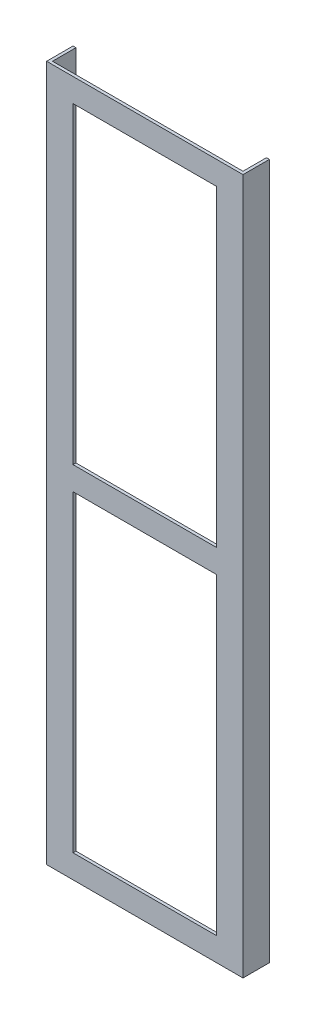
ISO-10303-21;
HEADER;
FILE_DESCRIPTION(('STEP AP214'),'2;1');
FILE_NAME('part.step','',(''),(''),'','','');
FILE_SCHEMA(('AUTOMOTIVE_DESIGN { 1 0 10303 214 1 1 1 1 }'));
ENDSEC;
DATA;
#1=APPLICATION_CONTEXT('core data for automotive mechanical design processes');
#2=APPLICATION_PROTOCOL_DEFINITION('international standard','automotive_design',2000,#1);
#3=PRODUCT_CONTEXT('',#1,'mechanical');
#4=PRODUCT('Part','Part','',(#3));
#5=PRODUCT_RELATED_PRODUCT_CATEGORY('part','',(#4));
#6=PRODUCT_DEFINITION_FORMATION('','',#4);
#7=PRODUCT_DEFINITION_CONTEXT('part definition',#1,'design');
#8=PRODUCT_DEFINITION('design','',#6,#7);
#9=PRODUCT_DEFINITION_SHAPE('','',#8);
#10=(LENGTH_UNIT() NAMED_UNIT(*) SI_UNIT(.MILLI.,.METRE.));
#11=(NAMED_UNIT(*) PLANE_ANGLE_UNIT() SI_UNIT($,.RADIAN.));
#12=(NAMED_UNIT(*) SI_UNIT($,.STERADIAN.) SOLID_ANGLE_UNIT());
#13=UNCERTAINTY_MEASURE_WITH_UNIT(LENGTH_MEASURE(1.E-05),#10,'distance_accuracy_value','');
#14=(GEOMETRIC_REPRESENTATION_CONTEXT(3) GLOBAL_UNCERTAINTY_ASSIGNED_CONTEXT((#13)) GLOBAL_UNIT_ASSIGNED_CONTEXT((#10,
#11,#12)) REPRESENTATION_CONTEXT('',''));
#15=CARTESIAN_POINT('',(0.,0.,0.));
#16=DIRECTION('',(0.,0.,1.));
#17=DIRECTION('',(1.,0.,0.));
#18=AXIS2_PLACEMENT_3D('',#15,#16,#17);
#19=CARTESIAN_POINT('',(50.,376.8,50.));
#20=DIRECTION('',(0.,0.,-1.));
#21=DIRECTION('',(-1.,0.,0.));
#22=AXIS2_PLACEMENT_3D('',#19,#20,#21);
#23=PLANE('',#22);
#24=DIRECTION('',(0.,1.,0.));
#25=VECTOR('',#24,1.);
#26=CARTESIAN_POINT('',(-38.8875000000002,376.8,50.));
#27=LINE('',#26,#25);
#28=CARTESIAN_POINT('',(-38.8875000000002,194.75,50.));
#29=VERTEX_POINT('',#28);
#30=CARTESIAN_POINT('',(-38.8875000000002,364.1,50.));
#31=VERTEX_POINT('',#30);
#32=EDGE_CURVE('E213',#29,#31,#27,.T.);
#33=ORIENTED_EDGE('',*,*,#32,.F.);
#34=DIRECTION('',(1.,0.,0.));
#35=VECTOR('',#34,1.);
#36=CARTESIAN_POINT('',(0.,194.75,50.));
#37=LINE('',#36,#35);
#38=CARTESIAN_POINT('',(38.8874999999998,194.75,50.));
#39=VERTEX_POINT('',#38);
#40=EDGE_CURVE('E218',#29,#39,#37,.T.);
#41=ORIENTED_EDGE('',*,*,#40,.T.);
#42=DIRECTION('',(0.,-1.,0.));
#43=VECTOR('',#42,1.);
#44=CARTESIAN_POINT('',(38.8874999999998,376.8,50.));
#45=LINE('',#44,#43);
#46=CARTESIAN_POINT('',(38.8874999999998,364.1,50.));
#47=VERTEX_POINT('',#46);
#48=EDGE_CURVE('E237',#47,#39,#45,.T.);
#49=ORIENTED_EDGE('',*,*,#48,.F.);
#50=DIRECTION('',(1.,0.,0.));
#51=VECTOR('',#50,1.);
#52=CARTESIAN_POINT('',(50.,364.1,50.));
#53=LINE('',#52,#51);
#54=EDGE_CURVE('E227',#31,#47,#53,.T.);
#55=ORIENTED_EDGE('',*,*,#54,.F.);
#56=EDGE_LOOP('',(#33,#41,#49,#55));
#57=FACE_BOUND('',#56,.T.);
#58=DIRECTION('',(1.,0.,0.));
#59=VECTOR('',#58,1.);
#60=CARTESIAN_POINT('',(0.,182.05,50.));
#61=LINE('',#60,#59);
#62=CARTESIAN_POINT('',(-38.8875000000002,182.05,50.));
#63=VERTEX_POINT('',#62);
#64=CARTESIAN_POINT('',(38.8874999999998,182.05,50.));
#65=VERTEX_POINT('',#64);
#66=EDGE_CURVE('E47',#63,#65,#61,.T.);
#67=ORIENTED_EDGE('',*,*,#66,.F.);
#68=CARTESIAN_POINT('',(-38.8875000000001,12.7,50.));
#69=VERTEX_POINT('',#68);
#70=EDGE_CURVE('E241',#69,#63,#27,.T.);
#71=ORIENTED_EDGE('',*,*,#70,.F.);
#72=DIRECTION('',(-1.,0.,0.));
#73=VECTOR('',#72,1.);
#74=CARTESIAN_POINT('',(50.,12.7,50.));
#75=LINE('',#74,#73);
#76=CARTESIAN_POINT('',(38.8874999999997,12.7,50.));
#77=VERTEX_POINT('',#76);
#78=EDGE_CURVE('E226',#77,#69,#75,.T.);
#79=ORIENTED_EDGE('',*,*,#78,.F.);
#80=EDGE_CURVE('E230',#65,#77,#45,.T.);
#81=ORIENTED_EDGE('',*,*,#80,.F.);
#82=EDGE_LOOP('',(#67,#71,#79,#81));
#83=FACE_BOUND('',#82,.T.);
#84=DIRECTION('',(1.,0.,0.));
#85=VECTOR('',#84,1.);
#86=CARTESIAN_POINT('',(-51.6,0.,50.));
#87=LINE('',#86,#85);
#88=CARTESIAN_POINT('',(-51.5875000000001,0.,50.));
#89=VERTEX_POINT('',#88);
#90=CARTESIAN_POINT('',(51.5875,0.,50.));
#91=VERTEX_POINT('',#90);
#92=EDGE_CURVE('E60',#89,#91,#87,.T.);
#93=ORIENTED_EDGE('',*,*,#92,.F.);
#94=DIRECTION('',(0.,-1.,0.));
#95=VECTOR('',#94,1.);
#96=CARTESIAN_POINT('',(-51.5875,376.8,50.));
#97=LINE('',#96,#95);
#98=CARTESIAN_POINT('',(-51.5875,376.8,50.));
#99=VERTEX_POINT('',#98);
#100=EDGE_CURVE('E55',#99,#89,#97,.T.);
#101=ORIENTED_EDGE('',*,*,#100,.F.);
#102=DIRECTION('',(1.,0.,0.));
#103=VECTOR('',#102,1.);
#104=CARTESIAN_POINT('',(50.,376.8,50.));
#105=LINE('',#104,#103);
#106=CARTESIAN_POINT('',(51.5875,376.8,50.));
#107=VERTEX_POINT('',#106);
#108=EDGE_CURVE('E41',#99,#107,#105,.T.);
#109=ORIENTED_EDGE('',*,*,#108,.T.);
#110=DIRECTION('',(0.,1.,0.));
#111=VECTOR('',#110,1.);
#112=CARTESIAN_POINT('',(51.5875,376.8,50.));
#113=LINE('',#112,#111);
#114=EDGE_CURVE('E184',#91,#107,#113,.T.);
#115=ORIENTED_EDGE('',*,*,#114,.F.);
#116=EDGE_LOOP('',(#93,#101,#109,#115));
#117=FACE_BOUND('',#116,.T.);
#118=ADVANCED_FACE('F37',(#57,#83,#117),#23,.T.);
#119=CARTESIAN_POINT('',(0.,376.8,0.));
#120=DIRECTION('',(0.,-1.,0.));
#121=DIRECTION('',(0.,0.,-1.));
#122=AXIS2_PLACEMENT_3D('',#119,#120,#121);
#123=PLANE('',#122);
#124=DIRECTION('',(1.,0.,0.));
#125=VECTOR('',#124,1.);
#126=CARTESIAN_POINT('',(51.5875,376.8,51.5875));
#127=LINE('',#126,#125);
#128=CARTESIAN_POINT('',(-53.175,376.8,51.5875));
#129=VERTEX_POINT('',#128);
#130=CARTESIAN_POINT('',(53.175,376.8,51.5875));
#131=VERTEX_POINT('',#130);
#132=EDGE_CURVE('E214',#129,#131,#127,.T.);
#133=ORIENTED_EDGE('',*,*,#132,.T.);
#134=DIRECTION('',(0.,0.,1.));
#135=VECTOR('',#134,1.);
#136=CARTESIAN_POINT('',(53.175,376.8,51.5875));
#137=LINE('',#136,#135);
#138=CARTESIAN_POINT('',(53.175,376.8,37.3));
#139=VERTEX_POINT('',#138);
#140=EDGE_CURVE('E282',#139,#131,#137,.T.);
#141=ORIENTED_EDGE('',*,*,#140,.F.);
#142=DIRECTION('',(1.,0.,0.));
#143=VECTOR('',#142,1.);
#144=CARTESIAN_POINT('',(53.175,376.8,37.3));
#145=LINE('',#144,#143);
#146=CARTESIAN_POINT('',(51.5875,376.8,37.3));
#147=VERTEX_POINT('',#146);
#148=EDGE_CURVE('E192',#147,#139,#145,.T.);
#149=ORIENTED_EDGE('',*,*,#148,.F.);
#150=DIRECTION('',(0.,0.,1.));
#151=VECTOR('',#150,1.);
#152=CARTESIAN_POINT('',(51.5875,376.8,37.3));
#153=LINE('',#152,#151);
#154=EDGE_CURVE('E195',#147,#107,#153,.T.);
#155=ORIENTED_EDGE('',*,*,#154,.T.);
#156=ORIENTED_EDGE('',*,*,#108,.F.);
#157=DIRECTION('',(0.,0.,1.));
#158=VECTOR('',#157,1.);
#159=CARTESIAN_POINT('',(-51.5875,376.8,37.3));
#160=LINE('',#159,#158);
#161=CARTESIAN_POINT('',(-51.5875,376.8,37.3));
#162=VERTEX_POINT('',#161);
#163=EDGE_CURVE('E166',#162,#99,#160,.T.);
#164=ORIENTED_EDGE('',*,*,#163,.F.);
#165=DIRECTION('',(1.,0.,0.));
#166=VECTOR('',#165,1.);
#167=CARTESIAN_POINT('',(-53.175,376.8,37.3));
#168=LINE('',#167,#166);
#169=CARTESIAN_POINT('',(-53.175,376.8,37.3));
#170=VERTEX_POINT('',#169);
#171=EDGE_CURVE('E164',#170,#162,#168,.T.);
#172=ORIENTED_EDGE('',*,*,#171,.F.);
#173=DIRECTION('',(0.,0.,1.));
#174=VECTOR('',#173,1.);
#175=CARTESIAN_POINT('',(-53.175,376.8,51.5875));
#176=LINE('',#175,#174);
#177=EDGE_CURVE('E152',#170,#129,#176,.T.);
#178=ORIENTED_EDGE('',*,*,#177,.T.);
#179=EDGE_LOOP('',(#133,#141,#149,#155,#156,#164,#172,#178));
#180=FACE_BOUND('',#179,.T.);
#181=ADVANCED_FACE('F39',(#180),#123,.F.);
#182=CARTESIAN_POINT('',(0.,0.,0.));
#183=DIRECTION('',(0.,-1.,0.));
#184=DIRECTION('',(0.,0.,-1.));
#185=AXIS2_PLACEMENT_3D('',#182,#183,#184);
#186=PLANE('',#185);
#187=DIRECTION('',(0.,0.,-1.));
#188=VECTOR('',#187,1.);
#189=CARTESIAN_POINT('',(-53.175,0.,51.5875));
#190=LINE('',#189,#188);
#191=CARTESIAN_POINT('',(-53.175,0.,51.5875));
#192=VERTEX_POINT('',#191);
#193=CARTESIAN_POINT('',(-53.175,0.,37.3));
#194=VERTEX_POINT('',#193);
#195=EDGE_CURVE('E161',#192,#194,#190,.T.);
#196=ORIENTED_EDGE('',*,*,#195,.T.);
#197=DIRECTION('',(-1.,0.,0.));
#198=VECTOR('',#197,1.);
#199=CARTESIAN_POINT('',(-53.175,0.,37.3));
#200=LINE('',#199,#198);
#201=CARTESIAN_POINT('',(-51.5875000000001,0.,37.3));
#202=VERTEX_POINT('',#201);
#203=EDGE_CURVE('E174',#202,#194,#200,.T.);
#204=ORIENTED_EDGE('',*,*,#203,.F.);
#205=DIRECTION('',(0.,0.,1.));
#206=VECTOR('',#205,1.);
#207=CARTESIAN_POINT('',(-51.5875000000001,0.,37.3));
#208=LINE('',#207,#206);
#209=EDGE_CURVE('E179',#202,#89,#208,.T.);
#210=ORIENTED_EDGE('',*,*,#209,.T.);
#211=ORIENTED_EDGE('',*,*,#92,.T.);
#212=DIRECTION('',(0.,0.,1.));
#213=VECTOR('',#212,1.);
#214=CARTESIAN_POINT('',(51.5875,0.,37.3));
#215=LINE('',#214,#213);
#216=CARTESIAN_POINT('',(51.5875,0.,37.3));
#217=VERTEX_POINT('',#216);
#218=EDGE_CURVE('E206',#217,#91,#215,.T.);
#219=ORIENTED_EDGE('',*,*,#218,.F.);
#220=DIRECTION('',(-1.,0.,0.));
#221=VECTOR('',#220,1.);
#222=CARTESIAN_POINT('',(53.175,0.,37.3));
#223=LINE('',#222,#221);
#224=CARTESIAN_POINT('',(53.175,0.,37.3));
#225=VERTEX_POINT('',#224);
#226=EDGE_CURVE('E188',#225,#217,#223,.T.);
#227=ORIENTED_EDGE('',*,*,#226,.F.);
#228=DIRECTION('',(0.,0.,-1.));
#229=VECTOR('',#228,1.);
#230=CARTESIAN_POINT('',(53.175,0.,51.5875));
#231=LINE('',#230,#229);
#232=CARTESIAN_POINT('',(53.175,0.,51.5875));
#233=VERTEX_POINT('',#232);
#234=EDGE_CURVE('E345',#233,#225,#231,.T.);
#235=ORIENTED_EDGE('',*,*,#234,.F.);
#236=DIRECTION('',(1.,0.,0.));
#237=VECTOR('',#236,1.);
#238=CARTESIAN_POINT('',(51.5875,0.,51.5875));
#239=LINE('',#238,#237);
#240=EDGE_CURVE('E274',#192,#233,#239,.T.);
#241=ORIENTED_EDGE('',*,*,#240,.F.);
#242=EDGE_LOOP('',(#196,#204,#210,#211,#219,#227,#235,#241));
#243=FACE_BOUND('',#242,.T.);
#244=ADVANCED_FACE('F334',(#243),#186,.T.);
#245=CARTESIAN_POINT('',(-38.8874999999998,364.1,-51.6000000000001));
#246=DIRECTION('',(-1.,0.,0.));
#247=DIRECTION('',(0.,0.,1.));
#248=AXIS2_PLACEMENT_3D('',#245,#246,#247);
#249=PLANE('',#248);
#250=DIRECTION('',(0.,0.,1.));
#251=VECTOR('',#250,1.);
#252=CARTESIAN_POINT('',(-38.8875000000002,194.75,50.));
#253=LINE('',#252,#251);
#254=CARTESIAN_POINT('',(-38.8875000000002,194.75,51.5875));
#255=VERTEX_POINT('',#254);
#256=EDGE_CURVE('E262',#29,#255,#253,.T.);
#257=ORIENTED_EDGE('',*,*,#256,.F.);
#258=ORIENTED_EDGE('',*,*,#32,.T.);
#259=DIRECTION('',(0.,0.,1.));
#260=VECTOR('',#259,1.);
#261=CARTESIAN_POINT('',(-38.8874999999998,364.1,-51.6000000000001));
#262=LINE('',#261,#260);
#263=CARTESIAN_POINT('',(-38.8875000000002,364.1,51.5875));
#264=VERTEX_POINT('',#263);
#265=EDGE_CURVE('E220',#31,#264,#262,.T.);
#266=ORIENTED_EDGE('',*,*,#265,.T.);
#267=DIRECTION('',(0.,1.,0.));
#268=VECTOR('',#267,1.);
#269=CARTESIAN_POINT('',(-38.8875000000002,376.8,51.5875));
#270=LINE('',#269,#268);
#271=EDGE_CURVE('E246',#255,#264,#270,.T.);
#272=ORIENTED_EDGE('',*,*,#271,.F.);
#273=EDGE_LOOP('',(#257,#258,#266,#272));
#274=FACE_BOUND('',#273,.T.);
#275=ADVANCED_FACE('F295',(#274),#249,.F.);
#276=CARTESIAN_POINT('',(38.8875000000002,364.1,-51.5999999999999));
#277=DIRECTION('',(1.,0.,0.));
#278=DIRECTION('',(0.,0.,-1.));
#279=AXIS2_PLACEMENT_3D('',#276,#277,#278);
#280=PLANE('',#279);
#281=DIRECTION('',(0.,0.,1.));
#282=VECTOR('',#281,1.);
#283=CARTESIAN_POINT('',(38.8874999999998,194.75,50.));
#284=LINE('',#283,#282);
#285=CARTESIAN_POINT('',(38.8874999999998,194.75,51.5875));
#286=VERTEX_POINT('',#285);
#287=EDGE_CURVE('E223',#39,#286,#284,.T.);
#288=ORIENTED_EDGE('',*,*,#287,.T.);
#289=DIRECTION('',(0.,-1.,0.));
#290=VECTOR('',#289,1.);
#291=CARTESIAN_POINT('',(38.8874999999998,376.8,51.5875));
#292=LINE('',#291,#290);
#293=CARTESIAN_POINT('',(38.8874999999998,364.1,51.5875));
#294=VERTEX_POINT('',#293);
#295=EDGE_CURVE('E278',#294,#286,#292,.T.);
#296=ORIENTED_EDGE('',*,*,#295,.F.);
#297=DIRECTION('',(0.,0.,1.));
#298=VECTOR('',#297,1.);
#299=CARTESIAN_POINT('',(38.8875000000002,364.1,-51.5999999999999));
#300=LINE('',#299,#298);
#301=EDGE_CURVE('E224',#47,#294,#300,.T.);
#302=ORIENTED_EDGE('',*,*,#301,.F.);
#303=ORIENTED_EDGE('',*,*,#48,.T.);
#304=EDGE_LOOP('',(#288,#296,#302,#303));
#305=FACE_BOUND('',#304,.T.);
#306=ADVANCED_FACE('F332',(#305),#280,.F.);
#307=CARTESIAN_POINT('',(51.5875,376.8,51.5875));
#308=DIRECTION('',(0.,0.,-1.));
#309=DIRECTION('',(-1.,0.,0.));
#310=AXIS2_PLACEMENT_3D('',#307,#308,#309);
#311=PLANE('',#310);
#312=DIRECTION('',(1.,0.,0.));
#313=VECTOR('',#312,1.);
#314=CARTESIAN_POINT('',(0.,194.75,51.5875));
#315=LINE('',#314,#313);
#316=EDGE_CURVE('E261',#255,#286,#315,.T.);
#317=ORIENTED_EDGE('',*,*,#316,.F.);
#318=ORIENTED_EDGE('',*,*,#271,.T.);
#319=DIRECTION('',(1.,0.,0.));
#320=VECTOR('',#319,1.);
#321=CARTESIAN_POINT('',(51.5875,364.1,51.5875));
#322=LINE('',#321,#320);
#323=EDGE_CURVE('E251',#264,#294,#322,.T.);
#324=ORIENTED_EDGE('',*,*,#323,.T.);
#325=ORIENTED_EDGE('',*,*,#295,.T.);
#326=EDGE_LOOP('',(#317,#318,#324,#325));
#327=FACE_BOUND('',#326,.T.);
#328=CARTESIAN_POINT('',(-38.8875000000003,12.7,51.5875));
#329=VERTEX_POINT('',#328);
#330=CARTESIAN_POINT('',(-38.8875000000002,182.05,51.5875));
#331=VERTEX_POINT('',#330);
#332=EDGE_CURVE('E253',#329,#331,#270,.T.);
#333=ORIENTED_EDGE('',*,*,#332,.T.);
#334=DIRECTION('',(1.,0.,0.));
#335=VECTOR('',#334,1.);
#336=CARTESIAN_POINT('',(0.,182.05,51.5875));
#337=LINE('',#336,#335);
#338=CARTESIAN_POINT('',(38.8874999999998,182.05,51.5875));
#339=VERTEX_POINT('',#338);
#340=EDGE_CURVE('E258',#331,#339,#337,.T.);
#341=ORIENTED_EDGE('',*,*,#340,.T.);
#342=CARTESIAN_POINT('',(38.8874999999999,12.7,51.5875));
#343=VERTEX_POINT('',#342);
#344=EDGE_CURVE('E260',#339,#343,#292,.T.);
#345=ORIENTED_EDGE('',*,*,#344,.T.);
#346=DIRECTION('',(-1.,0.,0.));
#347=VECTOR('',#346,1.);
#348=CARTESIAN_POINT('',(51.5875,12.7,51.5875));
#349=LINE('',#348,#347);
#350=EDGE_CURVE('E272',#343,#329,#349,.T.);
#351=ORIENTED_EDGE('',*,*,#350,.T.);
#352=EDGE_LOOP('',(#333,#341,#345,#351));
#353=FACE_BOUND('',#352,.T.);
#354=ORIENTED_EDGE('',*,*,#240,.T.);
#355=DIRECTION('',(0.,-1.,0.));
#356=VECTOR('',#355,1.);
#357=CARTESIAN_POINT('',(53.175,376.8,51.5875));
#358=LINE('',#357,#356);
#359=EDGE_CURVE('E342',#131,#233,#358,.T.);
#360=ORIENTED_EDGE('',*,*,#359,.F.);
#361=ORIENTED_EDGE('',*,*,#132,.F.);
#362=DIRECTION('',(0.,-1.,0.));
#363=VECTOR('',#362,1.);
#364=CARTESIAN_POINT('',(-53.175,376.8,51.5875));
#365=LINE('',#364,#363);
#366=EDGE_CURVE('E159',#129,#192,#365,.T.);
#367=ORIENTED_EDGE('',*,*,#366,.T.);
#368=EDGE_LOOP('',(#354,#360,#361,#367));
#369=FACE_BOUND('',#368,.T.);
#370=ADVANCED_FACE('F310',(#327,#353,#369),#311,.F.);
#371=ORIENTED_EDGE('',*,*,#70,.T.);
#372=DIRECTION('',(0.,0.,1.));
#373=VECTOR('',#372,1.);
#374=CARTESIAN_POINT('',(-38.8875000000002,182.05,50.));
#375=LINE('',#374,#373);
#376=EDGE_CURVE('E235',#63,#331,#375,.T.);
#377=ORIENTED_EDGE('',*,*,#376,.T.);
#378=ORIENTED_EDGE('',*,*,#332,.F.);
#379=DIRECTION('',(0.,0.,1.));
#380=VECTOR('',#379,1.);
#381=CARTESIAN_POINT('',(-38.8874999999998,12.7,-51.6000000000001));
#382=LINE('',#381,#380);
#383=EDGE_CURVE('E202',#69,#329,#382,.T.);
#384=ORIENTED_EDGE('',*,*,#383,.F.);
#385=EDGE_LOOP('',(#371,#377,#378,#384));
#386=FACE_BOUND('',#385,.T.);
#387=ADVANCED_FACE('F308',(#386),#249,.F.);
#388=ORIENTED_EDGE('',*,*,#344,.F.);
#389=DIRECTION('',(0.,0.,1.));
#390=VECTOR('',#389,1.);
#391=CARTESIAN_POINT('',(38.8874999999998,182.05,50.));
#392=LINE('',#391,#390);
#393=EDGE_CURVE('E11',#65,#339,#392,.T.);
#394=ORIENTED_EDGE('',*,*,#393,.F.);
#395=ORIENTED_EDGE('',*,*,#80,.T.);
#396=DIRECTION('',(0.,0.,1.));
#397=VECTOR('',#396,1.);
#398=CARTESIAN_POINT('',(38.8875000000002,12.7,-51.5999999999999));
#399=LINE('',#398,#397);
#400=EDGE_CURVE('E228',#77,#343,#399,.T.);
#401=ORIENTED_EDGE('',*,*,#400,.T.);
#402=EDGE_LOOP('',(#388,#394,#395,#401));
#403=FACE_BOUND('',#402,.T.);
#404=ADVANCED_FACE('F311',(#403),#280,.F.);
#405=CARTESIAN_POINT('',(-38.8874999999998,364.1,-51.6000000000001));
#406=DIRECTION('',(0.,1.,0.));
#407=DIRECTION('',(0.,0.,1.));
#408=AXIS2_PLACEMENT_3D('',#405,#406,#407);
#409=PLANE('',#408);
#410=ORIENTED_EDGE('',*,*,#265,.F.);
#411=ORIENTED_EDGE('',*,*,#54,.T.);
#412=ORIENTED_EDGE('',*,*,#301,.T.);
#413=ORIENTED_EDGE('',*,*,#323,.F.);
#414=EDGE_LOOP('',(#410,#411,#412,#413));
#415=FACE_BOUND('',#414,.T.);
#416=ADVANCED_FACE('F299',(#415),#409,.F.);
#417=CARTESIAN_POINT('',(-38.8874999999998,12.7,-51.6000000000001));
#418=DIRECTION('',(0.,-1.,0.));
#419=DIRECTION('',(0.,0.,-1.));
#420=AXIS2_PLACEMENT_3D('',#417,#418,#419);
#421=PLANE('',#420);
#422=ORIENTED_EDGE('',*,*,#400,.F.);
#423=ORIENTED_EDGE('',*,*,#78,.T.);
#424=ORIENTED_EDGE('',*,*,#383,.T.);
#425=ORIENTED_EDGE('',*,*,#350,.F.);
#426=EDGE_LOOP('',(#422,#423,#424,#425));
#427=FACE_BOUND('',#426,.T.);
#428=ADVANCED_FACE('F305',(#427),#421,.F.);
#429=CARTESIAN_POINT('',(0.,194.75,50.));
#430=DIRECTION('',(0.,-1.,0.));
#431=DIRECTION('',(0.,0.,-1.));
#432=AXIS2_PLACEMENT_3D('',#429,#430,#431);
#433=PLANE('',#432);
#434=ORIENTED_EDGE('',*,*,#316,.T.);
#435=ORIENTED_EDGE('',*,*,#287,.F.);
#436=ORIENTED_EDGE('',*,*,#40,.F.);
#437=ORIENTED_EDGE('',*,*,#256,.T.);
#438=EDGE_LOOP('',(#434,#435,#436,#437));
#439=FACE_BOUND('',#438,.T.);
#440=ADVANCED_FACE('F315',(#439),#433,.F.);
#441=CARTESIAN_POINT('',(0.,182.05,50.));
#442=DIRECTION('',(0.,-1.,0.));
#443=DIRECTION('',(0.,0.,-1.));
#444=AXIS2_PLACEMENT_3D('',#441,#442,#443);
#445=PLANE('',#444);
#446=ORIENTED_EDGE('',*,*,#340,.F.);
#447=ORIENTED_EDGE('',*,*,#376,.F.);
#448=ORIENTED_EDGE('',*,*,#66,.T.);
#449=ORIENTED_EDGE('',*,*,#393,.T.);
#450=EDGE_LOOP('',(#446,#447,#448,#449));
#451=FACE_BOUND('',#450,.T.);
#452=ADVANCED_FACE('F312',(#451),#445,.T.);
#453=CARTESIAN_POINT('',(53.175,0.,0.));
#454=DIRECTION('',(1.,0.,0.));
#455=DIRECTION('',(0.,0.,-1.));
#456=AXIS2_PLACEMENT_3D('',#453,#454,#455);
#457=PLANE('',#456);
#458=ORIENTED_EDGE('',*,*,#359,.T.);
#459=ORIENTED_EDGE('',*,*,#234,.T.);
#460=DIRECTION('',(0.,-1.,0.));
#461=VECTOR('',#460,1.);
#462=CARTESIAN_POINT('',(53.175,376.8,37.3));
#463=LINE('',#462,#461);
#464=EDGE_CURVE('E185',#139,#225,#463,.T.);
#465=ORIENTED_EDGE('',*,*,#464,.F.);
#466=ORIENTED_EDGE('',*,*,#140,.T.);
#467=EDGE_LOOP('',(#458,#459,#465,#466));
#468=FACE_BOUND('',#467,.T.);
#469=ADVANCED_FACE('F314',(#468),#457,.T.);
#470=CARTESIAN_POINT('',(-53.175,0.,0.));
#471=DIRECTION('',(-1.,0.,0.));
#472=DIRECTION('',(0.,0.,-1.));
#473=AXIS2_PLACEMENT_3D('',#470,#471,#472);
#474=PLANE('',#473);
#475=ORIENTED_EDGE('',*,*,#366,.F.);
#476=ORIENTED_EDGE('',*,*,#177,.F.);
#477=DIRECTION('',(0.,1.,0.));
#478=VECTOR('',#477,1.);
#479=CARTESIAN_POINT('',(-53.175,376.8,37.3));
#480=LINE('',#479,#478);
#481=EDGE_CURVE('E157',#194,#170,#480,.T.);
#482=ORIENTED_EDGE('',*,*,#481,.F.);
#483=ORIENTED_EDGE('',*,*,#195,.F.);
#484=EDGE_LOOP('',(#475,#476,#482,#483));
#485=FACE_BOUND('',#484,.T.);
#486=ADVANCED_FACE('F154',(#485),#474,.T.);
#487=CARTESIAN_POINT('',(51.5875,376.8,37.3));
#488=DIRECTION('',(1.,0.,0.));
#489=DIRECTION('',(0.,1.,0.));
#490=AXIS2_PLACEMENT_3D('',#487,#488,#489);
#491=PLANE('',#490);
#492=ORIENTED_EDGE('',*,*,#114,.T.);
#493=ORIENTED_EDGE('',*,*,#154,.F.);
#494=DIRECTION('',(0.,1.,0.));
#495=VECTOR('',#494,1.);
#496=CARTESIAN_POINT('',(51.5875,376.8,37.3));
#497=LINE('',#496,#495);
#498=EDGE_CURVE('E190',#217,#147,#497,.T.);
#499=ORIENTED_EDGE('',*,*,#498,.F.);
#500=ORIENTED_EDGE('',*,*,#218,.T.);
#501=EDGE_LOOP('',(#492,#493,#499,#500));
#502=FACE_BOUND('',#501,.T.);
#503=ADVANCED_FACE('F358',(#502),#491,.F.);
#504=CARTESIAN_POINT('',(0.,0.,37.3));
#505=DIRECTION('',(0.,0.,-1.));
#506=DIRECTION('',(-1.,0.,0.));
#507=AXIS2_PLACEMENT_3D('',#504,#505,#506);
#508=PLANE('',#507);
#509=ORIENTED_EDGE('',*,*,#464,.T.);
#510=ORIENTED_EDGE('',*,*,#226,.T.);
#511=ORIENTED_EDGE('',*,*,#498,.T.);
#512=ORIENTED_EDGE('',*,*,#148,.T.);
#513=EDGE_LOOP('',(#509,#510,#511,#512));
#514=FACE_BOUND('',#513,.T.);
#515=ADVANCED_FACE('F361',(#514),#508,.T.);
#516=CARTESIAN_POINT('',(-51.5875,376.8,37.3));
#517=DIRECTION('',(-1.,0.,0.));
#518=DIRECTION('',(0.,-1.,0.));
#519=AXIS2_PLACEMENT_3D('',#516,#517,#518);
#520=PLANE('',#519);
#521=ORIENTED_EDGE('',*,*,#100,.T.);
#522=ORIENTED_EDGE('',*,*,#209,.F.);
#523=DIRECTION('',(0.,-1.,0.));
#524=VECTOR('',#523,1.);
#525=CARTESIAN_POINT('',(-51.5875,376.8,37.3));
#526=LINE('',#525,#524);
#527=EDGE_CURVE('E169',#162,#202,#526,.T.);
#528=ORIENTED_EDGE('',*,*,#527,.F.);
#529=ORIENTED_EDGE('',*,*,#163,.T.);
#530=EDGE_LOOP('',(#521,#522,#528,#529));
#531=FACE_BOUND('',#530,.T.);
#532=ADVANCED_FACE('F365',(#531),#520,.F.);
#533=CARTESIAN_POINT('',(0.,0.,37.3));
#534=DIRECTION('',(0.,0.,1.));
#535=DIRECTION('',(1.,0.,0.));
#536=AXIS2_PLACEMENT_3D('',#533,#534,#535);
#537=PLANE('',#536);
#538=ORIENTED_EDGE('',*,*,#481,.T.);
#539=ORIENTED_EDGE('',*,*,#171,.T.);
#540=ORIENTED_EDGE('',*,*,#527,.T.);
#541=ORIENTED_EDGE('',*,*,#203,.T.);
#542=EDGE_LOOP('',(#538,#539,#540,#541));
#543=FACE_BOUND('',#542,.T.);
#544=ADVANCED_FACE('F172',(#543),#537,.F.);
#545=CLOSED_SHELL('',(#118,#181,#244,#275,#306,#370,#387,#404,#416,#428,#440,#452,#469,#486,
#503,#515,#532,#544));
#546=MANIFOLD_SOLID_BREP('B2',#545);
#547=ADVANCED_BREP_SHAPE_REPRESENTATION('',(#18,#546),#14);
#548=SHAPE_DEFINITION_REPRESENTATION(#9,#547);
ENDSEC;
END-ISO-10303-21;
